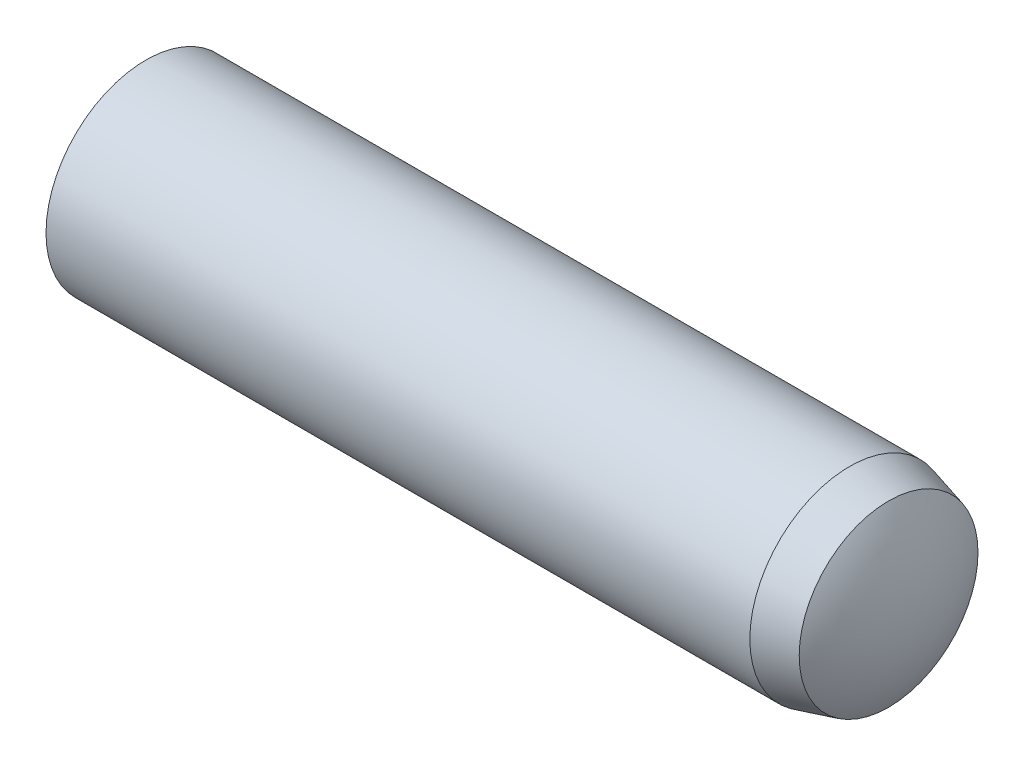
ISO-10303-21;
HEADER;
FILE_DESCRIPTION(('STEP AP214'),'2;1');
FILE_NAME('part.step','',(''),(''),'','','');
FILE_SCHEMA(('AUTOMOTIVE_DESIGN { 1 0 10303 214 1 1 1 1 }'));
ENDSEC;
DATA;
#1=APPLICATION_CONTEXT('core data for automotive mechanical design processes');
#2=APPLICATION_PROTOCOL_DEFINITION('international standard','automotive_design',2000,#1);
#3=PRODUCT_CONTEXT('',#1,'mechanical');
#4=PRODUCT('Part','Part','',(#3));
#5=PRODUCT_RELATED_PRODUCT_CATEGORY('part','',(#4));
#6=PRODUCT_DEFINITION_FORMATION('','',#4);
#7=PRODUCT_DEFINITION_CONTEXT('part definition',#1,'design');
#8=PRODUCT_DEFINITION('design','',#6,#7);
#9=PRODUCT_DEFINITION_SHAPE('','',#8);
#10=(LENGTH_UNIT() NAMED_UNIT(*) SI_UNIT(.MILLI.,.METRE.));
#11=(NAMED_UNIT(*) PLANE_ANGLE_UNIT() SI_UNIT($,.RADIAN.));
#12=(NAMED_UNIT(*) SI_UNIT($,.STERADIAN.) SOLID_ANGLE_UNIT());
#13=UNCERTAINTY_MEASURE_WITH_UNIT(LENGTH_MEASURE(1.E-05),#10,'distance_accuracy_value','');
#14=(GEOMETRIC_REPRESENTATION_CONTEXT(3) GLOBAL_UNCERTAINTY_ASSIGNED_CONTEXT((#13)) GLOBAL_UNIT_ASSIGNED_CONTEXT((#10,
#11,#12)) REPRESENTATION_CONTEXT('',''));
#15=CARTESIAN_POINT('',(0.,0.,0.));
#16=DIRECTION('',(0.,0.,1.));
#17=DIRECTION('',(1.,0.,0.));
#18=AXIS2_PLACEMENT_3D('',#15,#16,#17);
#19=CARTESIAN_POINT('',(-5.,0.,0.));
#20=DIRECTION('',(1.,0.,0.));
#21=DIRECTION('',(0.,0.,-1.));
#22=AXIS2_PLACEMENT_3D('',#19,#20,#21);
#23=CYLINDRICAL_SURFACE('',#22,1.25);
#24=CARTESIAN_POINT('',(4.1875,0.,0.));
#25=DIRECTION('',(-1.,0.,0.));
#26=DIRECTION('',(0.,0.,1.));
#27=AXIS2_PLACEMENT_3D('',#24,#25,#26);
#28=CIRCLE('',#27,1.24999999999999);
#29=CARTESIAN_POINT('',(4.1875,0.,1.24999999999999));
#30=VERTEX_POINT('',#29);
#31=EDGE_CURVE('E11',#30,#30,#28,.T.);
#32=ORIENTED_EDGE('',*,*,#31,.T.);
#33=EDGE_LOOP('',(#32));
#34=FACE_BOUND('',#33,.T.);
#35=CARTESIAN_POINT('',(-4.625,0.,0.));
#36=DIRECTION('',(-1.,0.,0.));
#37=DIRECTION('',(0.,0.,1.));
#38=AXIS2_PLACEMENT_3D('',#35,#36,#37);
#39=CIRCLE('',#38,1.25);
#40=CARTESIAN_POINT('',(-4.625,0.,1.25));
#41=VERTEX_POINT('',#40);
#42=EDGE_CURVE('E52',#41,#41,#39,.T.);
#43=ORIENTED_EDGE('',*,*,#42,.F.);
#44=EDGE_LOOP('',(#43));
#45=FACE_BOUND('',#44,.T.);
#46=ADVANCED_FACE('F32',(#34,#45),#23,.T.);
#47=CARTESIAN_POINT('',(4.1875,0.,0.));
#48=DIRECTION('',(-1.,0.,0.));
#49=DIRECTION('',(0.,0.,1.));
#50=AXIS2_PLACEMENT_3D('',#47,#48,#49);
#51=CONICAL_SURFACE('',#50,1.24999999999999,0.261799387799151);
#52=CARTESIAN_POINT('',(4.675,0.,0.));
#53=DIRECTION('',(-1.,0.,0.));
#54=DIRECTION('',(0.,0.,1.));
#55=AXIS2_PLACEMENT_3D('',#52,#53,#54);
#56=CIRCLE('',#55,1.11937476868982);
#57=CARTESIAN_POINT('',(4.675,0.,1.11937476868982));
#58=VERTEX_POINT('',#57);
#59=EDGE_CURVE('E39',#58,#58,#56,.T.);
#60=ORIENTED_EDGE('',*,*,#59,.T.);
#61=EDGE_LOOP('',(#60));
#62=FACE_BOUND('',#61,.T.);
#63=ORIENTED_EDGE('',*,*,#31,.F.);
#64=EDGE_LOOP('',(#63));
#65=FACE_BOUND('',#64,.T.);
#66=ADVANCED_FACE('F58',(#62,#65),#51,.T.);
#67=CARTESIAN_POINT('',(2.90980788803168,0.,0.));
#68=DIRECTION('',(-1.,0.,0.));
#69=DIRECTION('',(0.,1.,0.));
#70=AXIS2_PLACEMENT_3D('',#67,#68,#69);
#71=SPHERICAL_SURFACE('',#70,2.09019211196832);
#72=CARTESIAN_POINT('',(5.,0.,0.));
#73=VERTEX_POINT('',#72);
#74=VERTEX_LOOP('',#73);
#75=FACE_BOUND('',#74,.T.);
#76=ORIENTED_EDGE('',*,*,#59,.F.);
#77=EDGE_LOOP('',(#76));
#78=FACE_BOUND('',#77,.T.);
#79=ADVANCED_FACE('F48',(#75,#78),#71,.T.);
#80=CARTESIAN_POINT('',(-2.72916666666667,0.,0.));
#81=DIRECTION('',(-1.,0.,0.));
#82=DIRECTION('',(0.,-1.,0.));
#83=AXIS2_PLACEMENT_3D('',#80,#81,#82);
#84=SPHERICAL_SURFACE('',#83,2.27083333333333);
#85=CARTESIAN_POINT('',(-5.,0.,0.));
#86=VERTEX_POINT('',#85);
#87=VERTEX_LOOP('',#86);
#88=FACE_BOUND('',#87,.T.);
#89=ORIENTED_EDGE('',*,*,#42,.T.);
#90=EDGE_LOOP('',(#89));
#91=FACE_BOUND('',#90,.T.);
#92=ADVANCED_FACE('F45',(#88,#91),#84,.T.);
#93=CLOSED_SHELL('',(#46,#66,#79,#92));
#94=MANIFOLD_SOLID_BREP('B2',#93);
#95=ADVANCED_BREP_SHAPE_REPRESENTATION('',(#18,#94),#14);
#96=SHAPE_DEFINITION_REPRESENTATION(#9,#95);
ENDSEC;
END-ISO-10303-21;
